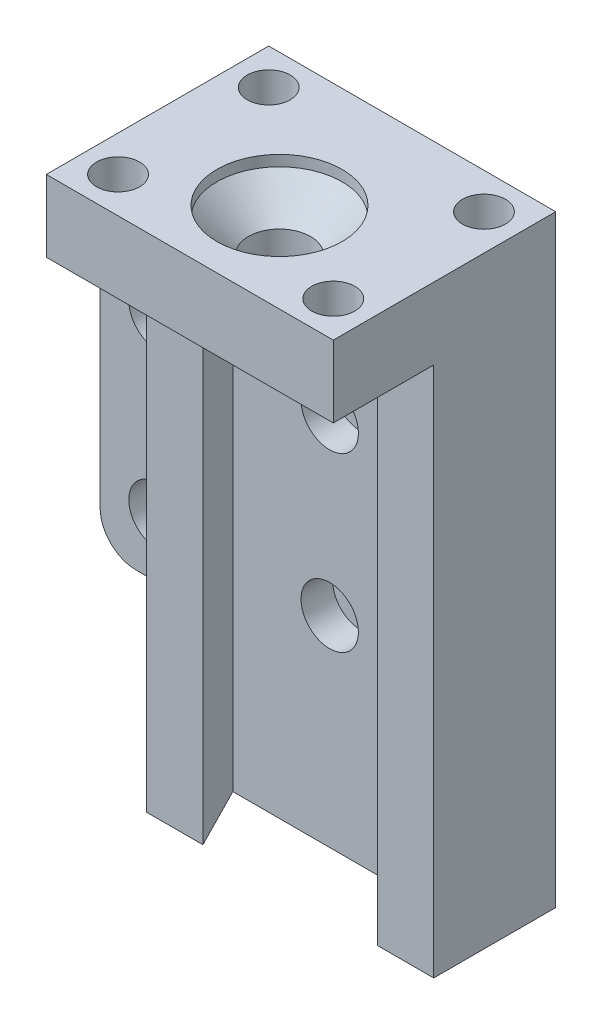
ISO-10303-21;
HEADER;
FILE_DESCRIPTION(('STEP AP214'),'2;1');
FILE_NAME('part.step','',(''),(''),'','','');
FILE_SCHEMA(('AUTOMOTIVE_DESIGN { 1 0 10303 214 1 1 1 1 }'));
ENDSEC;
DATA;
#1=APPLICATION_CONTEXT('core data for automotive mechanical design processes');
#2=APPLICATION_PROTOCOL_DEFINITION('international standard','automotive_design',2000,#1);
#3=PRODUCT_CONTEXT('',#1,'mechanical');
#4=PRODUCT('Part','Part','',(#3));
#5=PRODUCT_RELATED_PRODUCT_CATEGORY('part','',(#4));
#6=PRODUCT_DEFINITION_FORMATION('','',#4);
#7=PRODUCT_DEFINITION_CONTEXT('part definition',#1,'design');
#8=PRODUCT_DEFINITION('design','',#6,#7);
#9=PRODUCT_DEFINITION_SHAPE('','',#8);
#10=(LENGTH_UNIT() NAMED_UNIT(*) SI_UNIT(.MILLI.,.METRE.));
#11=(NAMED_UNIT(*) PLANE_ANGLE_UNIT() SI_UNIT($,.RADIAN.));
#12=(NAMED_UNIT(*) SI_UNIT($,.STERADIAN.) SOLID_ANGLE_UNIT());
#13=UNCERTAINTY_MEASURE_WITH_UNIT(LENGTH_MEASURE(1.E-05),#10,'distance_accuracy_value','');
#14=(GEOMETRIC_REPRESENTATION_CONTEXT(3) GLOBAL_UNCERTAINTY_ASSIGNED_CONTEXT((#13)) GLOBAL_UNIT_ASSIGNED_CONTEXT((#10,
#11,#12)) REPRESENTATION_CONTEXT('',''));
#15=CARTESIAN_POINT('',(0.,0.,0.));
#16=DIRECTION('',(0.,0.,1.));
#17=DIRECTION('',(1.,0.,0.));
#18=AXIS2_PLACEMENT_3D('',#15,#16,#17);
#19=CARTESIAN_POINT('',(0.,-20.,10.));
#20=DIRECTION('',(0.,-1.,0.));
#21=DIRECTION('',(1.,0.,0.));
#22=AXIS2_PLACEMENT_3D('',#19,#20,#21);
#23=PLANE('',#22);
#24=DIRECTION('',(1.,0.,0.));
#25=VECTOR('',#24,1.);
#26=CARTESIAN_POINT('',(-15.,-20.,8.50000000000001));
#27=LINE('',#26,#25);
#28=CARTESIAN_POINT('',(-15.,-20.,8.50000000000001));
#29=VERTEX_POINT('',#28);
#30=CARTESIAN_POINT('',(-9.99999999999999,-20.,8.50000000000001));
#31=VERTEX_POINT('',#30);
#32=EDGE_CURVE('E373',#29,#31,#27,.T.);
#33=ORIENTED_EDGE('',*,*,#32,.F.);
#34=DIRECTION('',(0.,0.,-1.));
#35=VECTOR('',#34,1.);
#36=CARTESIAN_POINT('',(-15.,-20.,10.));
#37=LINE('',#36,#35);
#38=CARTESIAN_POINT('',(-15.,-20.,0.));
#39=VERTEX_POINT('',#38);
#40=EDGE_CURVE('E203',#29,#39,#37,.T.);
#41=ORIENTED_EDGE('',*,*,#40,.T.);
#42=DIRECTION('',(-1.,0.,0.));
#43=VECTOR('',#42,1.);
#44=CARTESIAN_POINT('',(0.,-20.,0.));
#45=LINE('',#44,#43);
#46=CARTESIAN_POINT('',(-9.99999999999999,-20.,0.));
#47=VERTEX_POINT('',#46);
#48=EDGE_CURVE('E193',#47,#39,#45,.T.);
#49=ORIENTED_EDGE('',*,*,#48,.F.);
#50=DIRECTION('',(0.,0.,1.));
#51=VECTOR('',#50,1.);
#52=CARTESIAN_POINT('',(-9.99999999999999,-20.,10.));
#53=LINE('',#52,#51);
#54=EDGE_CURVE('E201',#47,#31,#53,.T.);
#55=ORIENTED_EDGE('',*,*,#54,.T.);
#56=EDGE_LOOP('',(#33,#41,#49,#55));
#57=FACE_BOUND('',#56,.T.);
#58=ADVANCED_FACE('F34',(#57),#23,.T.);
#59=CARTESIAN_POINT('',(0.,20.,10.));
#60=DIRECTION('',(0.,-1.,0.));
#61=DIRECTION('',(1.,0.,0.));
#62=AXIS2_PLACEMENT_3D('',#59,#60,#61);
#63=PLANE('',#62);
#64=DIRECTION('',(0.,0.,-1.));
#65=VECTOR('',#64,1.);
#66=CARTESIAN_POINT('',(-15.,20.,10.));
#67=LINE('',#66,#65);
#68=CARTESIAN_POINT('',(-15.,20.,0.));
#69=VERTEX_POINT('',#68);
#70=CARTESIAN_POINT('',(-15.,20.,8.50000000000001));
#71=VERTEX_POINT('',#70);
#72=EDGE_CURVE('E179',#69,#71,#67,.F.);
#73=ORIENTED_EDGE('',*,*,#72,.T.);
#74=DIRECTION('',(-1.,0.,0.));
#75=VECTOR('',#74,1.);
#76=CARTESIAN_POINT('',(-9.99999999999999,20.,8.50000000000001));
#77=LINE('',#76,#75);
#78=CARTESIAN_POINT('',(-9.99999999999999,20.,8.50000000000001));
#79=VERTEX_POINT('',#78);
#80=EDGE_CURVE('E49',#79,#71,#77,.T.);
#81=ORIENTED_EDGE('',*,*,#80,.F.);
#82=DIRECTION('',(0.,0.,1.));
#83=VECTOR('',#82,1.);
#84=CARTESIAN_POINT('',(-9.99999999999999,20.,0.));
#85=LINE('',#84,#83);
#86=CARTESIAN_POINT('',(-9.99999999999999,20.,0.));
#87=VERTEX_POINT('',#86);
#88=EDGE_CURVE('E171',#79,#87,#85,.F.);
#89=ORIENTED_EDGE('',*,*,#88,.T.);
#90=DIRECTION('',(-1.,0.,0.));
#91=VECTOR('',#90,1.);
#92=CARTESIAN_POINT('',(0.,20.,0.));
#93=LINE('',#92,#91);
#94=EDGE_CURVE('E214',#87,#69,#93,.T.);
#95=ORIENTED_EDGE('',*,*,#94,.T.);
#96=EDGE_LOOP('',(#73,#81,#89,#95));
#97=FACE_BOUND('',#96,.T.);
#98=ADVANCED_FACE('F245',(#97),#63,.F.);
#99=CARTESIAN_POINT('',(35.,40.,17.));
#100=DIRECTION('',(0.,0.,-1.));
#101=DIRECTION('',(-1.,0.,0.));
#102=AXIS2_PLACEMENT_3D('',#99,#100,#101);
#103=PLANE('',#102);
#104=DIRECTION('',(1.,0.,0.));
#105=VECTOR('',#104,1.);
#106=CARTESIAN_POINT('',(-4.99999999999999,34.,17.));
#107=LINE('',#106,#105);
#108=CARTESIAN_POINT('',(-4.99999999999999,34.,17.));
#109=VERTEX_POINT('',#108);
#110=CARTESIAN_POINT('',(2.83096632070263,34.,17.));
#111=VERTEX_POINT('',#110);
#112=EDGE_CURVE('E216',#109,#111,#107,.T.);
#113=ORIENTED_EDGE('',*,*,#112,.F.);
#114=DIRECTION('',(0.,-1.,0.));
#115=VECTOR('',#114,1.);
#116=CARTESIAN_POINT('',(-4.99999999999999,40.,17.));
#117=LINE('',#116,#115);
#118=CARTESIAN_POINT('',(-4.99999999999998,-40.,17.));
#119=VERTEX_POINT('',#118);
#120=EDGE_CURVE('E235',#109,#119,#117,.T.);
#121=ORIENTED_EDGE('',*,*,#120,.T.);
#122=DIRECTION('',(1.,0.,0.));
#123=VECTOR('',#122,1.);
#124=CARTESIAN_POINT('',(35.,-40.,17.));
#125=LINE('',#124,#123);
#126=CARTESIAN_POINT('',(2.83096632070264,-40.,17.));
#127=VERTEX_POINT('',#126);
#128=EDGE_CURVE('E312',#119,#127,#125,.T.);
#129=ORIENTED_EDGE('',*,*,#128,.T.);
#130=DIRECTION('',(0.,1.,0.));
#131=VECTOR('',#130,1.);
#132=CARTESIAN_POINT('',(2.83096632070264,-74.0771184227775,17.));
#133=LINE('',#132,#131);
#134=EDGE_CURVE('E291',#127,#111,#133,.T.);
#135=ORIENTED_EDGE('',*,*,#134,.T.);
#136=EDGE_LOOP('',(#113,#121,#129,#135));
#137=FACE_BOUND('',#136,.T.);
#138=ADVANCED_FACE('F454',(#137),#103,.F.);
#139=CARTESIAN_POINT('',(27.1690336792974,34.,17.));
#140=VERTEX_POINT('',#139);
#141=CARTESIAN_POINT('',(35.,34.,17.));
#142=VERTEX_POINT('',#141);
#143=EDGE_CURVE('E209',#140,#142,#107,.T.);
#144=ORIENTED_EDGE('',*,*,#143,.F.);
#145=DIRECTION('',(0.,1.,0.));
#146=VECTOR('',#145,1.);
#147=CARTESIAN_POINT('',(27.1690336792974,-74.0771184227775,17.));
#148=LINE('',#147,#146);
#149=CARTESIAN_POINT('',(27.1690336792974,-40.,17.));
#150=VERTEX_POINT('',#149);
#151=EDGE_CURVE('E283',#150,#140,#148,.T.);
#152=ORIENTED_EDGE('',*,*,#151,.F.);
#153=CARTESIAN_POINT('',(35.,-40.,17.));
#154=VERTEX_POINT('',#153);
#155=EDGE_CURVE('E311',#150,#154,#125,.T.);
#156=ORIENTED_EDGE('',*,*,#155,.T.);
#157=DIRECTION('',(0.,-1.,0.));
#158=VECTOR('',#157,1.);
#159=CARTESIAN_POINT('',(35.,40.,17.));
#160=LINE('',#159,#158);
#161=EDGE_CURVE('E237',#142,#154,#160,.T.);
#162=ORIENTED_EDGE('',*,*,#161,.F.);
#163=EDGE_LOOP('',(#144,#152,#156,#162));
#164=FACE_BOUND('',#163,.T.);
#165=ADVANCED_FACE('F322',(#164),#103,.F.);
#166=CARTESIAN_POINT('',(-20.,0.,10.));
#167=DIRECTION('',(-1.,0.,0.));
#168=DIRECTION('',(0.,0.,1.));
#169=AXIS2_PLACEMENT_3D('',#166,#167,#168);
#170=PLANE('',#169);
#171=DIRECTION('',(0.,-1.,0.));
#172=VECTOR('',#171,1.);
#173=CARTESIAN_POINT('',(-20.,15.,8.50000000000001));
#174=LINE('',#173,#172);
#175=CARTESIAN_POINT('',(-20.,15.,8.50000000000001));
#176=VERTEX_POINT('',#175);
#177=CARTESIAN_POINT('',(-20.,-15.,8.50000000000001));
#178=VERTEX_POINT('',#177);
#179=EDGE_CURVE('E230',#176,#178,#174,.T.);
#180=ORIENTED_EDGE('',*,*,#179,.F.);
#181=DIRECTION('',(0.,0.,-1.));
#182=VECTOR('',#181,1.);
#183=CARTESIAN_POINT('',(-20.,15.,0.));
#184=LINE('',#183,#182);
#185=CARTESIAN_POINT('',(-20.,15.,0.));
#186=VERTEX_POINT('',#185);
#187=EDGE_CURVE('E182',#176,#186,#184,.T.);
#188=ORIENTED_EDGE('',*,*,#187,.T.);
#189=DIRECTION('',(0.,1.,0.));
#190=VECTOR('',#189,1.);
#191=CARTESIAN_POINT('',(-20.,0.,0.));
#192=LINE('',#191,#190);
#193=CARTESIAN_POINT('',(-20.,-15.,0.));
#194=VERTEX_POINT('',#193);
#195=EDGE_CURVE('E206',#194,#186,#192,.T.);
#196=ORIENTED_EDGE('',*,*,#195,.F.);
#197=DIRECTION('',(0.,0.,-1.));
#198=VECTOR('',#197,1.);
#199=CARTESIAN_POINT('',(-20.,-15.,10.));
#200=LINE('',#199,#198);
#201=EDGE_CURVE('E177',#194,#178,#200,.F.);
#202=ORIENTED_EDGE('',*,*,#201,.T.);
#203=EDGE_LOOP('',(#180,#188,#196,#202));
#204=FACE_BOUND('',#203,.T.);
#205=ADVANCED_FACE('F227',(#204),#170,.T.);
#206=CARTESIAN_POINT('',(35.,0.,10.));
#207=DIRECTION('',(-1.,0.,0.));
#208=DIRECTION('',(0.,0.,1.));
#209=AXIS2_PLACEMENT_3D('',#206,#207,#208);
#210=PLANE('',#209);
#211=DIRECTION('',(0.,0.,-1.));
#212=VECTOR('',#211,1.);
#213=CARTESIAN_POINT('',(35.,-40.,3.));
#214=LINE('',#213,#212);
#215=CARTESIAN_POINT('',(35.,-40.,0.));
#216=VERTEX_POINT('',#215);
#217=EDGE_CURVE('E306',#154,#216,#214,.T.);
#218=ORIENTED_EDGE('',*,*,#217,.T.);
#219=DIRECTION('',(0.,1.,0.));
#220=VECTOR('',#219,1.);
#221=CARTESIAN_POINT('',(35.,0.,0.));
#222=LINE('',#221,#220);
#223=CARTESIAN_POINT('',(35.,44.,0.));
#224=VERTEX_POINT('',#223);
#225=EDGE_CURVE('E205',#216,#224,#222,.T.);
#226=ORIENTED_EDGE('',*,*,#225,.T.);
#227=DIRECTION('',(0.,0.,-1.));
#228=VECTOR('',#227,1.);
#229=CARTESIAN_POINT('',(35.,44.,3.));
#230=LINE('',#229,#228);
#231=CARTESIAN_POINT('',(35.,44.,31.));
#232=VERTEX_POINT('',#231);
#233=EDGE_CURVE('E255',#232,#224,#230,.T.);
#234=ORIENTED_EDGE('',*,*,#233,.F.);
#235=DIRECTION('',(0.,1.,0.));
#236=VECTOR('',#235,1.);
#237=CARTESIAN_POINT('',(35.,40.,31.));
#238=LINE('',#237,#236);
#239=CARTESIAN_POINT('',(35.,34.,31.));
#240=VERTEX_POINT('',#239);
#241=EDGE_CURVE('E270',#240,#232,#238,.T.);
#242=ORIENTED_EDGE('',*,*,#241,.F.);
#243=DIRECTION('',(0.,0.,-1.));
#244=VECTOR('',#243,1.);
#245=CARTESIAN_POINT('',(35.,34.,31.));
#246=LINE('',#245,#244);
#247=EDGE_CURVE('E271',#240,#142,#246,.T.);
#248=ORIENTED_EDGE('',*,*,#247,.T.);
#249=ORIENTED_EDGE('',*,*,#161,.T.);
#250=EDGE_LOOP('',(#218,#226,#234,#242,#248,#249));
#251=FACE_BOUND('',#250,.T.);
#252=ADVANCED_FACE('F315',(#251),#210,.F.);
#253=CARTESIAN_POINT('',(0.,0.,0.));
#254=DIRECTION('',(0.,0.,1.));
#255=DIRECTION('',(1.,0.,0.));
#256=AXIS2_PLACEMENT_3D('',#253,#254,#255);
#257=PLANE('',#256);
#258=CARTESIAN_POINT('',(-12.,12.,0.));
#259=DIRECTION('',(0.,0.,1.));
#260=DIRECTION('',(1.,0.,0.));
#261=AXIS2_PLACEMENT_3D('',#258,#259,#260);
#262=CIRCLE('',#261,2.25);
#263=CARTESIAN_POINT('',(-9.75,12.,0.));
#264=VERTEX_POINT('',#263);
#265=EDGE_CURVE('E411',#264,#264,#262,.T.);
#266=ORIENTED_EDGE('',*,*,#265,.T.);
#267=EDGE_LOOP('',(#266));
#268=FACE_BOUND('',#267,.T.);
#269=CARTESIAN_POINT('',(12.,12.,0.));
#270=DIRECTION('',(0.,0.,1.));
#271=DIRECTION('',(1.,0.,0.));
#272=AXIS2_PLACEMENT_3D('',#269,#270,#271);
#273=CIRCLE('',#272,2.25);
#274=CARTESIAN_POINT('',(14.25,12.,0.));
#275=VERTEX_POINT('',#274);
#276=EDGE_CURVE('E399',#275,#275,#273,.T.);
#277=ORIENTED_EDGE('',*,*,#276,.T.);
#278=EDGE_LOOP('',(#277));
#279=FACE_BOUND('',#278,.T.);
#280=CARTESIAN_POINT('',(12.,-12.,0.));
#281=DIRECTION('',(0.,0.,1.));
#282=DIRECTION('',(1.,0.,0.));
#283=AXIS2_PLACEMENT_3D('',#280,#281,#282);
#284=CIRCLE('',#283,2.25);
#285=CARTESIAN_POINT('',(14.25,-12.,0.));
#286=VERTEX_POINT('',#285);
#287=EDGE_CURVE('E387',#286,#286,#284,.T.);
#288=ORIENTED_EDGE('',*,*,#287,.T.);
#289=EDGE_LOOP('',(#288));
#290=FACE_BOUND('',#289,.T.);
#291=CARTESIAN_POINT('',(-12.,-12.,0.));
#292=DIRECTION('',(0.,0.,1.));
#293=DIRECTION('',(1.,0.,0.));
#294=AXIS2_PLACEMENT_3D('',#291,#292,#293);
#295=CIRCLE('',#294,2.25);
#296=CARTESIAN_POINT('',(-9.75,-12.,0.));
#297=VERTEX_POINT('',#296);
#298=EDGE_CURVE('E163',#297,#297,#295,.T.);
#299=ORIENTED_EDGE('',*,*,#298,.T.);
#300=EDGE_LOOP('',(#299));
#301=FACE_BOUND('',#300,.T.);
#302=ORIENTED_EDGE('',*,*,#48,.T.);
#303=CARTESIAN_POINT('',(-15.,-15.,0.));
#304=DIRECTION('',(0.,0.,1.));
#305=DIRECTION('',(1.,0.,0.));
#306=AXIS2_PLACEMENT_3D('',#303,#304,#305);
#307=CIRCLE('',#306,5.);
#308=EDGE_CURVE('E221',#39,#194,#307,.F.);
#309=ORIENTED_EDGE('',*,*,#308,.T.);
#310=ORIENTED_EDGE('',*,*,#195,.T.);
#311=CARTESIAN_POINT('',(-15.,15.,0.));
#312=DIRECTION('',(0.,0.,1.));
#313=DIRECTION('',(1.,0.,0.));
#314=AXIS2_PLACEMENT_3D('',#311,#312,#313);
#315=CIRCLE('',#314,5.);
#316=EDGE_CURVE('E211',#186,#69,#315,.F.);
#317=ORIENTED_EDGE('',*,*,#316,.T.);
#318=ORIENTED_EDGE('',*,*,#94,.F.);
#319=CARTESIAN_POINT('',(-9.99999999999999,25.,0.));
#320=DIRECTION('',(0.,0.,1.));
#321=DIRECTION('',(1.,0.,0.));
#322=AXIS2_PLACEMENT_3D('',#319,#320,#321);
#323=CIRCLE('',#322,5.);
#324=CARTESIAN_POINT('',(-4.99999999999999,25.,0.));
#325=VERTEX_POINT('',#324);
#326=EDGE_CURVE('E11',#87,#325,#323,.T.);
#327=ORIENTED_EDGE('',*,*,#326,.T.);
#328=DIRECTION('',(0.,-1.,0.));
#329=VECTOR('',#328,1.);
#330=CARTESIAN_POINT('',(-4.99999999999999,44.,0.));
#331=LINE('',#330,#329);
#332=CARTESIAN_POINT('',(-4.99999999999999,44.,0.));
#333=VERTEX_POINT('',#332);
#334=EDGE_CURVE('E176',#333,#325,#331,.T.);
#335=ORIENTED_EDGE('',*,*,#334,.F.);
#336=DIRECTION('',(-1.,0.,0.));
#337=VECTOR('',#336,1.);
#338=CARTESIAN_POINT('',(35.,44.,0.));
#339=LINE('',#338,#337);
#340=EDGE_CURVE('E248',#224,#333,#339,.T.);
#341=ORIENTED_EDGE('',*,*,#340,.F.);
#342=ORIENTED_EDGE('',*,*,#225,.F.);
#343=DIRECTION('',(1.,0.,0.));
#344=VECTOR('',#343,1.);
#345=CARTESIAN_POINT('',(35.,-40.,0.));
#346=LINE('',#345,#344);
#347=CARTESIAN_POINT('',(-4.99999999999999,-40.,0.));
#348=VERTEX_POINT('',#347);
#349=EDGE_CURVE('E256',#348,#216,#346,.T.);
#350=ORIENTED_EDGE('',*,*,#349,.F.);
#351=DIRECTION('',(0.,-1.,0.));
#352=VECTOR('',#351,1.);
#353=CARTESIAN_POINT('',(-4.99999999999999,-20.,0.));
#354=LINE('',#353,#352);
#355=CARTESIAN_POINT('',(-4.99999999999999,-25.,0.));
#356=VERTEX_POINT('',#355);
#357=EDGE_CURVE('E195',#356,#348,#354,.T.);
#358=ORIENTED_EDGE('',*,*,#357,.F.);
#359=CARTESIAN_POINT('',(-9.99999999999999,-25.,0.));
#360=DIRECTION('',(0.,0.,1.));
#361=DIRECTION('',(1.,0.,0.));
#362=AXIS2_PLACEMENT_3D('',#359,#360,#361);
#363=CIRCLE('',#362,5.);
#364=EDGE_CURVE('E42',#356,#47,#363,.T.);
#365=ORIENTED_EDGE('',*,*,#364,.T.);
#366=EDGE_LOOP('',(#302,#309,#310,#317,#318,#327,#335,#341,#342,#350,#358,#365));
#367=FACE_BOUND('',#366,.T.);
#368=ADVANCED_FACE('F192',(#268,#279,#290,#301,#367),#257,.F.);
#369=CARTESIAN_POINT('',(-4.99999999999999,40.,3.));
#370=DIRECTION('',(1.,0.,0.));
#371=DIRECTION('',(0.,0.,-1.));
#372=AXIS2_PLACEMENT_3D('',#369,#370,#371);
#373=PLANE('',#372);
#374=DIRECTION('',(0.,1.,0.));
#375=VECTOR('',#374,1.);
#376=CARTESIAN_POINT('',(-4.99999999999999,-25.,8.50000000000001));
#377=LINE('',#376,#375);
#378=CARTESIAN_POINT('',(-4.99999999999999,-25.,8.50000000000001));
#379=VERTEX_POINT('',#378);
#380=CARTESIAN_POINT('',(-4.99999999999999,25.,8.49999999999999));
#381=VERTEX_POINT('',#380);
#382=EDGE_CURVE('E156',#379,#381,#377,.T.);
#383=ORIENTED_EDGE('',*,*,#382,.F.);
#384=DIRECTION('',(0.,0.,1.));
#385=VECTOR('',#384,1.);
#386=CARTESIAN_POINT('',(-4.99999999999999,-25.,3.));
#387=LINE('',#386,#385);
#388=EDGE_CURVE('E57',#379,#356,#387,.F.);
#389=ORIENTED_EDGE('',*,*,#388,.T.);
#390=ORIENTED_EDGE('',*,*,#357,.T.);
#391=DIRECTION('',(0.,0.,1.));
#392=VECTOR('',#391,1.);
#393=CARTESIAN_POINT('',(-4.99999999999999,-40.,3.));
#394=LINE('',#393,#392);
#395=EDGE_CURVE('E308',#348,#119,#394,.T.);
#396=ORIENTED_EDGE('',*,*,#395,.T.);
#397=ORIENTED_EDGE('',*,*,#120,.F.);
#398=DIRECTION('',(0.,0.,-1.));
#399=VECTOR('',#398,1.);
#400=CARTESIAN_POINT('',(-4.99999999999999,34.,31.));
#401=LINE('',#400,#399);
#402=CARTESIAN_POINT('',(-4.99999999999999,34.,31.));
#403=VERTEX_POINT('',#402);
#404=EDGE_CURVE('E276',#403,#109,#401,.T.);
#405=ORIENTED_EDGE('',*,*,#404,.F.);
#406=DIRECTION('',(0.,-1.,0.));
#407=VECTOR('',#406,1.);
#408=CARTESIAN_POINT('',(-4.99999999999999,40.,31.));
#409=LINE('',#408,#407);
#410=CARTESIAN_POINT('',(-4.99999999999999,44.,31.));
#411=VERTEX_POINT('',#410);
#412=EDGE_CURVE('E265',#411,#403,#409,.T.);
#413=ORIENTED_EDGE('',*,*,#412,.F.);
#414=DIRECTION('',(0.,0.,1.));
#415=VECTOR('',#414,1.);
#416=CARTESIAN_POINT('',(-4.99999999999999,44.,3.));
#417=LINE('',#416,#415);
#418=EDGE_CURVE('E249',#333,#411,#417,.T.);
#419=ORIENTED_EDGE('',*,*,#418,.F.);
#420=ORIENTED_EDGE('',*,*,#334,.T.);
#421=DIRECTION('',(0.,0.,1.));
#422=VECTOR('',#421,1.);
#423=CARTESIAN_POINT('',(-4.99999999999999,25.,10.));
#424=LINE('',#423,#422);
#425=EDGE_CURVE('E170',#325,#381,#424,.T.);
#426=ORIENTED_EDGE('',*,*,#425,.T.);
#427=EDGE_LOOP('',(#383,#389,#390,#396,#397,#405,#413,#419,#420,#426));
#428=FACE_BOUND('',#427,.T.);
#429=ADVANCED_FACE('F174',(#428),#373,.F.);
#430=CARTESIAN_POINT('',(0.,-40.,0.));
#431=DIRECTION('',(0.,-1.,0.));
#432=DIRECTION('',(1.,0.,0.));
#433=AXIS2_PLACEMENT_3D('',#430,#431,#432);
#434=PLANE('',#433);
#435=DIRECTION('',(0.453990499739545,0.,-0.891006524188369));
#436=VECTOR('',#435,1.);
#437=CARTESIAN_POINT('',(31.5,-40.,8.5));
#438=LINE('',#437,#436);
#439=CARTESIAN_POINT('',(31.5,-40.,8.5));
#440=VERTEX_POINT('',#439);
#441=EDGE_CURVE('E297',#150,#440,#438,.T.);
#442=ORIENTED_EDGE('',*,*,#441,.T.);
#443=DIRECTION('',(-1.,0.,0.));
#444=VECTOR('',#443,1.);
#445=CARTESIAN_POINT('',(-1.49999999999998,-40.,8.5));
#446=LINE('',#445,#444);
#447=CARTESIAN_POINT('',(-1.49999999999999,-40.,8.5));
#448=VERTEX_POINT('',#447);
#449=EDGE_CURVE('E293',#440,#448,#446,.T.);
#450=ORIENTED_EDGE('',*,*,#449,.T.);
#451=DIRECTION('',(0.453990499739545,0.,0.891006524188369));
#452=VECTOR('',#451,1.);
#453=CARTESIAN_POINT('',(-1.49999999999998,-40.,8.5));
#454=LINE('',#453,#452);
#455=EDGE_CURVE('E288',#448,#127,#454,.T.);
#456=ORIENTED_EDGE('',*,*,#455,.T.);
#457=ORIENTED_EDGE('',*,*,#128,.F.);
#458=ORIENTED_EDGE('',*,*,#395,.F.);
#459=ORIENTED_EDGE('',*,*,#349,.T.);
#460=ORIENTED_EDGE('',*,*,#217,.F.);
#461=ORIENTED_EDGE('',*,*,#155,.F.);
#462=EDGE_LOOP('',(#442,#450,#456,#457,#458,#459,#460,#461));
#463=FACE_BOUND('',#462,.T.);
#464=ADVANCED_FACE('F324',(#463),#434,.T.);
#465=CARTESIAN_POINT('',(0.,34.,0.));
#466=DIRECTION('',(0.,1.,0.));
#467=DIRECTION('',(0.,0.,1.));
#468=AXIS2_PLACEMENT_3D('',#465,#466,#467);
#469=PLANE('',#468);
#470=CARTESIAN_POINT('',(15.,34.,18.5));
#471=DIRECTION('',(0.,1.,0.));
#472=DIRECTION('',(0.,0.,1.));
#473=AXIS2_PLACEMENT_3D('',#470,#471,#472);
#474=CIRCLE('',#473,4.325);
#475=CARTESIAN_POINT('',(15.,34.,22.825));
#476=VERTEX_POINT('',#475);
#477=EDGE_CURVE('E361',#476,#476,#474,.F.);
#478=ORIENTED_EDGE('',*,*,#477,.F.);
#479=EDGE_LOOP('',(#478));
#480=FACE_BOUND('',#479,.T.);
#481=CARTESIAN_POINT('',(2.12779385389692E-13,34.,26.));
#482=DIRECTION('',(0.,1.,0.));
#483=DIRECTION('',(-1.,0.,0.));
#484=AXIS2_PLACEMENT_3D('',#481,#482,#483);
#485=CIRCLE('',#484,3.);
#486=CARTESIAN_POINT('',(-2.99999999999979,34.,26.));
#487=VERTEX_POINT('',#486);
#488=EDGE_CURVE('E341',#487,#487,#485,.T.);
#489=ORIENTED_EDGE('',*,*,#488,.T.);
#490=EDGE_LOOP('',(#489));
#491=FACE_BOUND('',#490,.T.);
#492=CARTESIAN_POINT('',(30.0000000000002,34.,26.));
#493=DIRECTION('',(0.,1.,0.));
#494=DIRECTION('',(-1.,0.,0.));
#495=AXIS2_PLACEMENT_3D('',#492,#493,#494);
#496=CIRCLE('',#495,3.);
#497=CARTESIAN_POINT('',(27.0000000000002,34.,26.));
#498=VERTEX_POINT('',#497);
#499=EDGE_CURVE('E348',#498,#498,#496,.T.);
#500=ORIENTED_EDGE('',*,*,#499,.T.);
#501=EDGE_LOOP('',(#500));
#502=FACE_BOUND('',#501,.T.);
#503=DIRECTION('',(0.453990499739545,0.,0.891006524188369));
#504=VECTOR('',#503,1.);
#505=CARTESIAN_POINT('',(-1.49999999999999,34.,8.5));
#506=LINE('',#505,#504);
#507=CARTESIAN_POINT('',(-1.49999999999999,34.,8.5));
#508=VERTEX_POINT('',#507);
#509=EDGE_CURVE('E279',#508,#111,#506,.T.);
#510=ORIENTED_EDGE('',*,*,#509,.F.);
#511=DIRECTION('',(-1.,0.,0.));
#512=VECTOR('',#511,1.);
#513=CARTESIAN_POINT('',(-1.49999999999999,34.,8.5));
#514=LINE('',#513,#512);
#515=CARTESIAN_POINT('',(31.5,34.,8.5));
#516=VERTEX_POINT('',#515);
#517=EDGE_CURVE('E280',#516,#508,#514,.T.);
#518=ORIENTED_EDGE('',*,*,#517,.F.);
#519=DIRECTION('',(0.453990499739545,0.,-0.891006524188369));
#520=VECTOR('',#519,1.);
#521=CARTESIAN_POINT('',(31.5,34.,8.5));
#522=LINE('',#521,#520);
#523=EDGE_CURVE('E284',#140,#516,#522,.T.);
#524=ORIENTED_EDGE('',*,*,#523,.F.);
#525=ORIENTED_EDGE('',*,*,#143,.T.);
#526=ORIENTED_EDGE('',*,*,#247,.F.);
#527=DIRECTION('',(1.,0.,0.));
#528=VECTOR('',#527,1.);
#529=CARTESIAN_POINT('',(-4.99999999999999,34.,31.));
#530=LINE('',#529,#528);
#531=EDGE_CURVE('E268',#403,#240,#530,.T.);
#532=ORIENTED_EDGE('',*,*,#531,.F.);
#533=ORIENTED_EDGE('',*,*,#404,.T.);
#534=ORIENTED_EDGE('',*,*,#112,.T.);
#535=EDGE_LOOP('',(#510,#518,#524,#525,#526,#532,#533,#534));
#536=FACE_BOUND('',#535,.T.);
#537=ADVANCED_FACE('F494',(#480,#491,#502,#536),#469,.F.);
#538=CARTESIAN_POINT('',(31.5,-74.0771184227775,8.5));
#539=DIRECTION('',(0.891006524188369,0.,0.453990499739545));
#540=DIRECTION('',(0.453990499739545,0.,-0.891006524188369));
#541=AXIS2_PLACEMENT_3D('',#538,#539,#540);
#542=PLANE('',#541);
#543=ORIENTED_EDGE('',*,*,#151,.T.);
#544=ORIENTED_EDGE('',*,*,#523,.T.);
#545=DIRECTION('',(0.,1.,0.));
#546=VECTOR('',#545,1.);
#547=CARTESIAN_POINT('',(31.5,-74.0771184227775,8.5));
#548=LINE('',#547,#546);
#549=EDGE_CURVE('E296',#440,#516,#548,.T.);
#550=ORIENTED_EDGE('',*,*,#549,.F.);
#551=ORIENTED_EDGE('',*,*,#441,.F.);
#552=EDGE_LOOP('',(#543,#544,#550,#551));
#553=FACE_BOUND('',#552,.T.);
#554=ADVANCED_FACE('F497',(#553),#542,.F.);
#555=CARTESIAN_POINT('',(-1.49999999999998,-74.0771184227775,8.5));
#556=DIRECTION('',(0.,0.,-1.));
#557=DIRECTION('',(-1.,0.,0.));
#558=AXIS2_PLACEMENT_3D('',#555,#556,#557);
#559=PLANE('',#558);
#560=CARTESIAN_POINT('',(12.,12.,8.5));
#561=DIRECTION('',(0.,0.,1.));
#562=DIRECTION('',(1.,0.,0.));
#563=AXIS2_PLACEMENT_3D('',#560,#561,#562);
#564=CIRCLE('',#563,4.);
#565=CARTESIAN_POINT('',(16.,12.,8.5));
#566=VERTEX_POINT('',#565);
#567=EDGE_CURVE('E408',#566,#566,#564,.T.);
#568=ORIENTED_EDGE('',*,*,#567,.F.);
#569=EDGE_LOOP('',(#568));
#570=FACE_BOUND('',#569,.T.);
#571=CARTESIAN_POINT('',(12.,-12.,8.5));
#572=DIRECTION('',(0.,0.,1.));
#573=DIRECTION('',(1.,0.,0.));
#574=AXIS2_PLACEMENT_3D('',#571,#572,#573);
#575=CIRCLE('',#574,4.);
#576=CARTESIAN_POINT('',(16.,-12.,8.5));
#577=VERTEX_POINT('',#576);
#578=EDGE_CURVE('E396',#577,#577,#575,.T.);
#579=ORIENTED_EDGE('',*,*,#578,.F.);
#580=EDGE_LOOP('',(#579));
#581=FACE_BOUND('',#580,.T.);
#582=ORIENTED_EDGE('',*,*,#549,.T.);
#583=ORIENTED_EDGE('',*,*,#517,.T.);
#584=DIRECTION('',(0.,1.,0.));
#585=VECTOR('',#584,1.);
#586=CARTESIAN_POINT('',(-1.49999999999998,-74.0771184227775,8.5));
#587=LINE('',#586,#585);
#588=EDGE_CURVE('E292',#448,#508,#587,.T.);
#589=ORIENTED_EDGE('',*,*,#588,.F.);
#590=ORIENTED_EDGE('',*,*,#449,.F.);
#591=EDGE_LOOP('',(#582,#583,#589,#590));
#592=FACE_BOUND('',#591,.T.);
#593=ADVANCED_FACE('F501',(#570,#581,#592),#559,.F.);
#594=CARTESIAN_POINT('',(-1.49999999999998,-74.0771184227775,8.5));
#595=DIRECTION('',(-0.891006524188369,0.,0.453990499739544));
#596=DIRECTION('',(0.453990499739545,0.,0.891006524188369));
#597=AXIS2_PLACEMENT_3D('',#594,#595,#596);
#598=PLANE('',#597);
#599=ORIENTED_EDGE('',*,*,#588,.T.);
#600=ORIENTED_EDGE('',*,*,#509,.T.);
#601=ORIENTED_EDGE('',*,*,#134,.F.);
#602=ORIENTED_EDGE('',*,*,#455,.F.);
#603=EDGE_LOOP('',(#599,#600,#601,#602));
#604=FACE_BOUND('',#603,.T.);
#605=ADVANCED_FACE('F492',(#604),#598,.F.);
#606=CARTESIAN_POINT('',(0.,0.,31.));
#607=DIRECTION('',(0.,0.,1.));
#608=DIRECTION('',(1.,0.,0.));
#609=AXIS2_PLACEMENT_3D('',#606,#607,#608);
#610=PLANE('',#609);
#611=ORIENTED_EDGE('',*,*,#412,.T.);
#612=ORIENTED_EDGE('',*,*,#531,.T.);
#613=ORIENTED_EDGE('',*,*,#241,.T.);
#614=DIRECTION('',(1.,0.,0.));
#615=VECTOR('',#614,1.);
#616=CARTESIAN_POINT('',(-4.99999999999999,44.,31.));
#617=LINE('',#616,#615);
#618=EDGE_CURVE('E262',#411,#232,#617,.T.);
#619=ORIENTED_EDGE('',*,*,#618,.F.);
#620=EDGE_LOOP('',(#611,#612,#613,#619));
#621=FACE_BOUND('',#620,.T.);
#622=ADVANCED_FACE('F488',(#621),#610,.T.);
#623=CARTESIAN_POINT('',(0.,44.,0.));
#624=DIRECTION('',(0.,1.,0.));
#625=DIRECTION('',(-1.,0.,0.));
#626=AXIS2_PLACEMENT_3D('',#623,#624,#625);
#627=PLANE('',#626);
#628=CARTESIAN_POINT('',(15.,44.,18.5));
#629=DIRECTION('',(0.,1.,0.));
#630=DIRECTION('',(0.,0.,1.));
#631=AXIS2_PLACEMENT_3D('',#628,#629,#630);
#632=CIRCLE('',#631,8.72499999999999);
#633=CARTESIAN_POINT('',(15.,44.,27.225));
#634=VERTEX_POINT('',#633);
#635=EDGE_CURVE('E358',#634,#634,#632,.T.);
#636=ORIENTED_EDGE('',*,*,#635,.F.);
#637=EDGE_LOOP('',(#636));
#638=FACE_BOUND('',#637,.T.);
#639=CARTESIAN_POINT('',(2.11044661913715E-13,44.,26.));
#640=DIRECTION('',(0.,1.,0.));
#641=DIRECTION('',(-1.,0.,0.));
#642=AXIS2_PLACEMENT_3D('',#639,#640,#641);
#643=CIRCLE('',#642,3.);
#644=CARTESIAN_POINT('',(-2.99999999999979,44.,26.));
#645=VERTEX_POINT('',#644);
#646=EDGE_CURVE('E338',#645,#645,#643,.T.);
#647=ORIENTED_EDGE('',*,*,#646,.F.);
#648=EDGE_LOOP('',(#647));
#649=FACE_BOUND('',#648,.T.);
#650=CARTESIAN_POINT('',(30.0000000000002,44.,26.));
#651=DIRECTION('',(0.,1.,0.));
#652=DIRECTION('',(-1.,0.,0.));
#653=AXIS2_PLACEMENT_3D('',#650,#651,#652);
#654=CIRCLE('',#653,3.);
#655=CARTESIAN_POINT('',(27.0000000000002,44.,26.));
#656=VERTEX_POINT('',#655);
#657=EDGE_CURVE('E345',#656,#656,#654,.T.);
#658=ORIENTED_EDGE('',*,*,#657,.F.);
#659=EDGE_LOOP('',(#658));
#660=FACE_BOUND('',#659,.T.);
#661=CARTESIAN_POINT('',(30.,44.,5.));
#662=DIRECTION('',(0.,1.,0.));
#663=DIRECTION('',(-1.,0.,0.));
#664=AXIS2_PLACEMENT_3D('',#661,#662,#663);
#665=CIRCLE('',#664,3.);
#666=CARTESIAN_POINT('',(27.,44.,5.));
#667=VERTEX_POINT('',#666);
#668=EDGE_CURVE('E351',#667,#667,#665,.T.);
#669=ORIENTED_EDGE('',*,*,#668,.F.);
#670=EDGE_LOOP('',(#669));
#671=FACE_BOUND('',#670,.T.);
#672=CARTESIAN_POINT('',(0.,44.,5.));
#673=DIRECTION('',(0.,1.,0.));
#674=DIRECTION('',(-1.,0.,0.));
#675=AXIS2_PLACEMENT_3D('',#672,#673,#674);
#676=CIRCLE('',#675,3.);
#677=CARTESIAN_POINT('',(-3.00000000000001,44.,5.));
#678=VERTEX_POINT('',#677);
#679=EDGE_CURVE('E332',#678,#678,#676,.T.);
#680=ORIENTED_EDGE('',*,*,#679,.F.);
#681=EDGE_LOOP('',(#680));
#682=FACE_BOUND('',#681,.T.);
#683=ORIENTED_EDGE('',*,*,#418,.T.);
#684=ORIENTED_EDGE('',*,*,#618,.T.);
#685=ORIENTED_EDGE('',*,*,#233,.T.);
#686=ORIENTED_EDGE('',*,*,#340,.T.);
#687=EDGE_LOOP('',(#683,#684,#685,#686));
#688=FACE_BOUND('',#687,.T.);
#689=ADVANCED_FACE('F253',(#638,#649,#660,#671,#682,#688),#627,.T.);
#690=CARTESIAN_POINT('',(-15.,-15.,10.));
#691=DIRECTION('',(0.,0.,-1.));
#692=DIRECTION('',(-1.,0.,0.));
#693=AXIS2_PLACEMENT_3D('',#690,#691,#692);
#694=CYLINDRICAL_SURFACE('',#693,5.);
#695=CARTESIAN_POINT('',(-15.,-15.,8.50000000000001));
#696=DIRECTION('',(0.,0.,-1.));
#697=DIRECTION('',(-1.,0.,0.));
#698=AXIS2_PLACEMENT_3D('',#695,#696,#697);
#699=CIRCLE('',#698,5.);
#700=EDGE_CURVE('E371',#178,#29,#699,.F.);
#701=ORIENTED_EDGE('',*,*,#700,.F.);
#702=ORIENTED_EDGE('',*,*,#201,.F.);
#703=ORIENTED_EDGE('',*,*,#308,.F.);
#704=ORIENTED_EDGE('',*,*,#40,.F.);
#705=EDGE_LOOP('',(#701,#702,#703,#704));
#706=FACE_BOUND('',#705,.T.);
#707=ADVANCED_FACE('F460',(#706),#694,.T.);
#708=CARTESIAN_POINT('',(-9.99999999999999,-25.,10.));
#709=DIRECTION('',(0.,0.,1.));
#710=DIRECTION('',(1.,0.,0.));
#711=AXIS2_PLACEMENT_3D('',#708,#709,#710);
#712=CYLINDRICAL_SURFACE('',#711,5.);
#713=ORIENTED_EDGE('',*,*,#388,.F.);
#714=CARTESIAN_POINT('',(-9.99999999999999,-25.,8.50000000000001));
#715=DIRECTION('',(0.,0.,-1.));
#716=DIRECTION('',(-1.,0.,0.));
#717=AXIS2_PLACEMENT_3D('',#714,#715,#716);
#718=CIRCLE('',#717,5.);
#719=EDGE_CURVE('E161',#31,#379,#718,.T.);
#720=ORIENTED_EDGE('',*,*,#719,.F.);
#721=ORIENTED_EDGE('',*,*,#54,.F.);
#722=ORIENTED_EDGE('',*,*,#364,.F.);
#723=EDGE_LOOP('',(#713,#720,#721,#722));
#724=FACE_BOUND('',#723,.T.);
#725=ADVANCED_FACE('F208',(#724),#712,.F.);
#726=CARTESIAN_POINT('',(-9.99999999999999,25.,3.));
#727=DIRECTION('',(0.,0.,-1.));
#728=DIRECTION('',(-1.,0.,0.));
#729=AXIS2_PLACEMENT_3D('',#726,#727,#728);
#730=CYLINDRICAL_SURFACE('',#729,5.);
#731=ORIENTED_EDGE('',*,*,#88,.F.);
#732=CARTESIAN_POINT('',(-9.99999999999999,25.,8.50000000000001));
#733=DIRECTION('',(0.,0.,-1.));
#734=DIRECTION('',(-1.,0.,0.));
#735=AXIS2_PLACEMENT_3D('',#732,#733,#734);
#736=CIRCLE('',#735,5.);
#737=EDGE_CURVE('E159',#381,#79,#736,.T.);
#738=ORIENTED_EDGE('',*,*,#737,.F.);
#739=ORIENTED_EDGE('',*,*,#425,.F.);
#740=ORIENTED_EDGE('',*,*,#326,.F.);
#741=EDGE_LOOP('',(#731,#738,#739,#740));
#742=FACE_BOUND('',#741,.T.);
#743=ADVANCED_FACE('F168',(#742),#730,.F.);
#744=CARTESIAN_POINT('',(-15.,15.,10.));
#745=DIRECTION('',(0.,0.,1.));
#746=DIRECTION('',(1.,0.,0.));
#747=AXIS2_PLACEMENT_3D('',#744,#745,#746);
#748=CYLINDRICAL_SURFACE('',#747,5.);
#749=CARTESIAN_POINT('',(-15.,15.,8.50000000000001));
#750=DIRECTION('',(0.,0.,-1.));
#751=DIRECTION('',(-1.,0.,0.));
#752=AXIS2_PLACEMENT_3D('',#749,#750,#751);
#753=CIRCLE('',#752,5.);
#754=EDGE_CURVE('E368',#71,#176,#753,.F.);
#755=ORIENTED_EDGE('',*,*,#754,.F.);
#756=ORIENTED_EDGE('',*,*,#72,.F.);
#757=ORIENTED_EDGE('',*,*,#316,.F.);
#758=ORIENTED_EDGE('',*,*,#187,.F.);
#759=EDGE_LOOP('',(#755,#756,#757,#758));
#760=FACE_BOUND('',#759,.T.);
#761=ADVANCED_FACE('F36',(#760),#748,.T.);
#762=CARTESIAN_POINT('',(0.,34.,5.));
#763=DIRECTION('',(0.,1.,0.));
#764=DIRECTION('',(-1.,0.,0.));
#765=AXIS2_PLACEMENT_3D('',#762,#763,#764);
#766=CYLINDRICAL_SURFACE('',#765,3.);
#767=CARTESIAN_POINT('',(0.,34.,5.));
#768=DIRECTION('',(0.,1.,0.));
#769=DIRECTION('',(-1.,0.,0.));
#770=AXIS2_PLACEMENT_3D('',#767,#768,#769);
#771=CIRCLE('',#770,3.);
#772=CARTESIAN_POINT('',(-3.00000000000001,34.,5.));
#773=VERTEX_POINT('',#772);
#774=EDGE_CURVE('E329',#773,#773,#771,.T.);
#775=ORIENTED_EDGE('',*,*,#774,.F.);
#776=EDGE_LOOP('',(#775));
#777=FACE_BOUND('',#776,.T.);
#778=ORIENTED_EDGE('',*,*,#679,.T.);
#779=EDGE_LOOP('',(#778));
#780=FACE_BOUND('',#779,.T.);
#781=ADVANCED_FACE('F469',(#777,#780),#766,.F.);
#782=CARTESIAN_POINT('',(0.,34.,5.));
#783=DIRECTION('',(0.,1.,0.));
#784=DIRECTION('',(-1.,0.,0.));
#785=AXIS2_PLACEMENT_3D('',#782,#783,#784);
#786=PLANE('',#785);
#787=ORIENTED_EDGE('',*,*,#774,.T.);
#788=EDGE_LOOP('',(#787));
#789=FACE_BOUND('',#788,.T.);
#790=ADVANCED_FACE('F473',(#789),#786,.T.);
#791=CARTESIAN_POINT('',(30.,34.,5.));
#792=DIRECTION('',(0.,1.,0.));
#793=DIRECTION('',(-1.,0.,0.));
#794=AXIS2_PLACEMENT_3D('',#791,#792,#793);
#795=CYLINDRICAL_SURFACE('',#794,3.);
#796=CARTESIAN_POINT('',(30.,34.,5.));
#797=DIRECTION('',(0.,1.,0.));
#798=DIRECTION('',(-1.,0.,0.));
#799=AXIS2_PLACEMENT_3D('',#796,#797,#798);
#800=CIRCLE('',#799,3.);
#801=CARTESIAN_POINT('',(27.,34.,5.));
#802=VERTEX_POINT('',#801);
#803=EDGE_CURVE('E336',#802,#802,#800,.T.);
#804=ORIENTED_EDGE('',*,*,#803,.F.);
#805=EDGE_LOOP('',(#804));
#806=FACE_BOUND('',#805,.T.);
#807=ORIENTED_EDGE('',*,*,#668,.T.);
#808=EDGE_LOOP('',(#807));
#809=FACE_BOUND('',#808,.T.);
#810=ADVANCED_FACE('F479',(#806,#809),#795,.F.);
#811=CARTESIAN_POINT('',(30.,34.,5.));
#812=DIRECTION('',(0.,1.,0.));
#813=DIRECTION('',(-1.,0.,0.));
#814=AXIS2_PLACEMENT_3D('',#811,#812,#813);
#815=PLANE('',#814);
#816=ORIENTED_EDGE('',*,*,#803,.T.);
#817=EDGE_LOOP('',(#816));
#818=FACE_BOUND('',#817,.T.);
#819=ADVANCED_FACE('F549',(#818),#815,.T.);
#820=CARTESIAN_POINT('',(30.0000000000002,34.,26.));
#821=DIRECTION('',(0.,1.,0.));
#822=DIRECTION('',(-1.,0.,0.));
#823=AXIS2_PLACEMENT_3D('',#820,#821,#822);
#824=CYLINDRICAL_SURFACE('',#823,3.);
#825=ORIENTED_EDGE('',*,*,#499,.F.);
#826=EDGE_LOOP('',(#825));
#827=FACE_BOUND('',#826,.T.);
#828=ORIENTED_EDGE('',*,*,#657,.T.);
#829=EDGE_LOOP('',(#828));
#830=FACE_BOUND('',#829,.T.);
#831=ADVANCED_FACE('F552',(#827,#830),#824,.F.);
#832=CARTESIAN_POINT('',(2.12779385389692E-13,34.,26.));
#833=DIRECTION('',(0.,1.,0.));
#834=DIRECTION('',(-1.,0.,0.));
#835=AXIS2_PLACEMENT_3D('',#832,#833,#834);
#836=CYLINDRICAL_SURFACE('',#835,3.);
#837=ORIENTED_EDGE('',*,*,#488,.F.);
#838=EDGE_LOOP('',(#837));
#839=FACE_BOUND('',#838,.T.);
#840=ORIENTED_EDGE('',*,*,#646,.T.);
#841=EDGE_LOOP('',(#840));
#842=FACE_BOUND('',#841,.T.);
#843=ADVANCED_FACE('F547',(#839,#842),#836,.F.);
#844=CARTESIAN_POINT('',(15.,38.1,18.5));
#845=DIRECTION('',(0.,1.,0.));
#846=DIRECTION('',(0.,0.,1.));
#847=AXIS2_PLACEMENT_3D('',#844,#845,#846);
#848=CONICAL_SURFACE('',#847,4.325,0.785398163397447);
#849=CARTESIAN_POINT('',(15.,42.5,18.5));
#850=DIRECTION('',(0.,1.,0.));
#851=DIRECTION('',(0.,0.,1.));
#852=AXIS2_PLACEMENT_3D('',#849,#850,#851);
#853=CIRCLE('',#852,8.72499999999999);
#854=CARTESIAN_POINT('',(15.,42.5,27.225));
#855=VERTEX_POINT('',#854);
#856=EDGE_CURVE('E342',#855,#855,#853,.T.);
#857=ORIENTED_EDGE('',*,*,#856,.T.);
#858=EDGE_LOOP('',(#857));
#859=FACE_BOUND('',#858,.T.);
#860=CARTESIAN_POINT('',(15.,38.1,18.5));
#861=DIRECTION('',(0.,1.,0.));
#862=DIRECTION('',(0.,0.,1.));
#863=AXIS2_PLACEMENT_3D('',#860,#861,#862);
#864=CIRCLE('',#863,4.325);
#865=CARTESIAN_POINT('',(15.,38.1,22.825));
#866=VERTEX_POINT('',#865);
#867=EDGE_CURVE('E364',#866,#866,#864,.T.);
#868=ORIENTED_EDGE('',*,*,#867,.F.);
#869=EDGE_LOOP('',(#868));
#870=FACE_BOUND('',#869,.T.);
#871=ADVANCED_FACE('F543',(#859,#870),#848,.F.);
#872=CARTESIAN_POINT('',(15.,44.,18.5));
#873=DIRECTION('',(0.,1.,0.));
#874=DIRECTION('',(0.,0.,1.));
#875=AXIS2_PLACEMENT_3D('',#872,#873,#874);
#876=CYLINDRICAL_SURFACE('',#875,8.72499999999999);
#877=ORIENTED_EDGE('',*,*,#635,.T.);
#878=EDGE_LOOP('',(#877));
#879=FACE_BOUND('',#878,.T.);
#880=ORIENTED_EDGE('',*,*,#856,.F.);
#881=EDGE_LOOP('',(#880));
#882=FACE_BOUND('',#881,.T.);
#883=ADVANCED_FACE('F539',(#879,#882),#876,.F.);
#884=CARTESIAN_POINT('',(15.,21.7670526854727,18.5));
#885=DIRECTION('',(0.,1.,0.));
#886=DIRECTION('',(0.,0.,1.));
#887=AXIS2_PLACEMENT_3D('',#884,#885,#886);
#888=CYLINDRICAL_SURFACE('',#887,4.325);
#889=ORIENTED_EDGE('',*,*,#477,.T.);
#890=EDGE_LOOP('',(#889));
#891=FACE_BOUND('',#890,.T.);
#892=ORIENTED_EDGE('',*,*,#867,.T.);
#893=EDGE_LOOP('',(#892));
#894=FACE_BOUND('',#893,.T.);
#895=ADVANCED_FACE('F429',(#891,#894),#888,.F.);
#896=CARTESIAN_POINT('',(-1.49999999999998,-74.0771184227775,8.5));
#897=DIRECTION('',(0.,0.,-1.));
#898=DIRECTION('',(-1.,0.,0.));
#899=AXIS2_PLACEMENT_3D('',#896,#897,#898);
#900=PLANE('',#899);
#901=CARTESIAN_POINT('',(-12.,12.,8.5));
#902=DIRECTION('',(0.,0.,1.));
#903=DIRECTION('',(1.,0.,0.));
#904=AXIS2_PLACEMENT_3D('',#901,#902,#903);
#905=CIRCLE('',#904,4.);
#906=CARTESIAN_POINT('',(-8.,12.,8.5));
#907=VERTEX_POINT('',#906);
#908=EDGE_CURVE('E420',#907,#907,#905,.T.);
#909=ORIENTED_EDGE('',*,*,#908,.F.);
#910=EDGE_LOOP('',(#909));
#911=FACE_BOUND('',#910,.T.);
#912=CARTESIAN_POINT('',(-12.,-12.,8.5));
#913=DIRECTION('',(0.,0.,1.));
#914=DIRECTION('',(1.,0.,0.));
#915=AXIS2_PLACEMENT_3D('',#912,#913,#914);
#916=CIRCLE('',#915,4.);
#917=CARTESIAN_POINT('',(-8.,-12.,8.5));
#918=VERTEX_POINT('',#917);
#919=EDGE_CURVE('E384',#918,#918,#916,.T.);
#920=ORIENTED_EDGE('',*,*,#919,.F.);
#921=EDGE_LOOP('',(#920));
#922=FACE_BOUND('',#921,.T.);
#923=ORIENTED_EDGE('',*,*,#719,.T.);
#924=ORIENTED_EDGE('',*,*,#382,.T.);
#925=ORIENTED_EDGE('',*,*,#737,.T.);
#926=ORIENTED_EDGE('',*,*,#80,.T.);
#927=ORIENTED_EDGE('',*,*,#754,.T.);
#928=ORIENTED_EDGE('',*,*,#179,.T.);
#929=ORIENTED_EDGE('',*,*,#700,.T.);
#930=ORIENTED_EDGE('',*,*,#32,.T.);
#931=EDGE_LOOP('',(#923,#924,#925,#926,#927,#928,#929,#930));
#932=FACE_BOUND('',#931,.T.);
#933=ADVANCED_FACE('F158',(#911,#922,#932),#900,.F.);
#934=CARTESIAN_POINT('',(-12.,-12.,8.5));
#935=DIRECTION('',(0.,0.,1.));
#936=DIRECTION('',(1.,0.,0.));
#937=AXIS2_PLACEMENT_3D('',#934,#935,#936);
#938=CYLINDRICAL_SURFACE('',#937,2.25);
#939=ORIENTED_EDGE('',*,*,#298,.F.);
#940=EDGE_LOOP('',(#939));
#941=FACE_BOUND('',#940,.T.);
#942=CARTESIAN_POINT('',(-12.,-12.,4.1));
#943=DIRECTION('',(0.,0.,1.));
#944=DIRECTION('',(1.,0.,0.));
#945=AXIS2_PLACEMENT_3D('',#942,#943,#944);
#946=CIRCLE('',#945,2.25);
#947=CARTESIAN_POINT('',(-9.75,-12.,4.1));
#948=VERTEX_POINT('',#947);
#949=EDGE_CURVE('E378',#948,#948,#946,.T.);
#950=ORIENTED_EDGE('',*,*,#949,.T.);
#951=EDGE_LOOP('',(#950));
#952=FACE_BOUND('',#951,.T.);
#953=ADVANCED_FACE('F428',(#941,#952),#938,.F.);
#954=CARTESIAN_POINT('',(-9.75,-12.,4.1));
#955=DIRECTION('',(0.,0.,-1.));
#956=DIRECTION('',(-1.,0.,0.));
#957=AXIS2_PLACEMENT_3D('',#954,#955,#956);
#958=PLANE('',#957);
#959=ORIENTED_EDGE('',*,*,#949,.F.);
#960=EDGE_LOOP('',(#959));
#961=FACE_BOUND('',#960,.T.);
#962=CARTESIAN_POINT('',(-12.,-12.,4.1));
#963=DIRECTION('',(0.,0.,1.));
#964=DIRECTION('',(1.,0.,0.));
#965=AXIS2_PLACEMENT_3D('',#962,#963,#964);
#966=CIRCLE('',#965,4.);
#967=CARTESIAN_POINT('',(-8.,-12.,4.1));
#968=VERTEX_POINT('',#967);
#969=EDGE_CURVE('E381',#968,#968,#966,.T.);
#970=ORIENTED_EDGE('',*,*,#969,.T.);
#971=EDGE_LOOP('',(#970));
#972=FACE_BOUND('',#971,.T.);
#973=ADVANCED_FACE('F436',(#961,#972),#958,.F.);
#974=CARTESIAN_POINT('',(-12.,-12.,8.5));
#975=DIRECTION('',(0.,0.,1.));
#976=DIRECTION('',(1.,0.,0.));
#977=AXIS2_PLACEMENT_3D('',#974,#975,#976);
#978=CYLINDRICAL_SURFACE('',#977,4.);
#979=ORIENTED_EDGE('',*,*,#969,.F.);
#980=EDGE_LOOP('',(#979));
#981=FACE_BOUND('',#980,.T.);
#982=ORIENTED_EDGE('',*,*,#919,.T.);
#983=EDGE_LOOP('',(#982));
#984=FACE_BOUND('',#983,.T.);
#985=ADVANCED_FACE('F433',(#981,#984),#978,.F.);
#986=CARTESIAN_POINT('',(12.,-12.,8.5));
#987=DIRECTION('',(0.,0.,1.));
#988=DIRECTION('',(1.,0.,0.));
#989=AXIS2_PLACEMENT_3D('',#986,#987,#988);
#990=CYLINDRICAL_SURFACE('',#989,2.25);
#991=ORIENTED_EDGE('',*,*,#287,.F.);
#992=EDGE_LOOP('',(#991));
#993=FACE_BOUND('',#992,.T.);
#994=CARTESIAN_POINT('',(12.,-12.,4.1));
#995=DIRECTION('',(0.,0.,1.));
#996=DIRECTION('',(1.,0.,0.));
#997=AXIS2_PLACEMENT_3D('',#994,#995,#996);
#998=CIRCLE('',#997,2.25);
#999=CARTESIAN_POINT('',(14.25,-12.,4.1));
#1000=VERTEX_POINT('',#999);
#1001=EDGE_CURVE('E390',#1000,#1000,#998,.T.);
#1002=ORIENTED_EDGE('',*,*,#1001,.T.);
#1003=EDGE_LOOP('',(#1002));
#1004=FACE_BOUND('',#1003,.T.);
#1005=ADVANCED_FACE('F435',(#993,#1004),#990,.F.);
#1006=CARTESIAN_POINT('',(14.25,-12.,4.1));
#1007=DIRECTION('',(0.,0.,-1.));
#1008=DIRECTION('',(-1.,0.,0.));
#1009=AXIS2_PLACEMENT_3D('',#1006,#1007,#1008);
#1010=PLANE('',#1009);
#1011=ORIENTED_EDGE('',*,*,#1001,.F.);
#1012=EDGE_LOOP('',(#1011));
#1013=FACE_BOUND('',#1012,.T.);
#1014=CARTESIAN_POINT('',(12.,-12.,4.1));
#1015=DIRECTION('',(0.,0.,1.));
#1016=DIRECTION('',(1.,0.,0.));
#1017=AXIS2_PLACEMENT_3D('',#1014,#1015,#1016);
#1018=CIRCLE('',#1017,4.);
#1019=CARTESIAN_POINT('',(16.,-12.,4.1));
#1020=VERTEX_POINT('',#1019);
#1021=EDGE_CURVE('E393',#1020,#1020,#1018,.T.);
#1022=ORIENTED_EDGE('',*,*,#1021,.T.);
#1023=EDGE_LOOP('',(#1022));
#1024=FACE_BOUND('',#1023,.T.);
#1025=ADVANCED_FACE('F443',(#1013,#1024),#1010,.F.);
#1026=CARTESIAN_POINT('',(12.,-12.,8.5));
#1027=DIRECTION('',(0.,0.,1.));
#1028=DIRECTION('',(1.,0.,0.));
#1029=AXIS2_PLACEMENT_3D('',#1026,#1027,#1028);
#1030=CYLINDRICAL_SURFACE('',#1029,4.);
#1031=ORIENTED_EDGE('',*,*,#1021,.F.);
#1032=EDGE_LOOP('',(#1031));
#1033=FACE_BOUND('',#1032,.T.);
#1034=ORIENTED_EDGE('',*,*,#578,.T.);
#1035=EDGE_LOOP('',(#1034));
#1036=FACE_BOUND('',#1035,.T.);
#1037=ADVANCED_FACE('F639',(#1033,#1036),#1030,.F.);
#1038=CARTESIAN_POINT('',(12.,12.,8.5));
#1039=DIRECTION('',(0.,0.,1.));
#1040=DIRECTION('',(1.,0.,0.));
#1041=AXIS2_PLACEMENT_3D('',#1038,#1039,#1040);
#1042=CYLINDRICAL_SURFACE('',#1041,2.25);
#1043=ORIENTED_EDGE('',*,*,#276,.F.);
#1044=EDGE_LOOP('',(#1043));
#1045=FACE_BOUND('',#1044,.T.);
#1046=CARTESIAN_POINT('',(12.,12.,4.1));
#1047=DIRECTION('',(0.,0.,1.));
#1048=DIRECTION('',(1.,0.,0.));
#1049=AXIS2_PLACEMENT_3D('',#1046,#1047,#1048);
#1050=CIRCLE('',#1049,2.25);
#1051=CARTESIAN_POINT('',(14.25,12.,4.1));
#1052=VERTEX_POINT('',#1051);
#1053=EDGE_CURVE('E402',#1052,#1052,#1050,.T.);
#1054=ORIENTED_EDGE('',*,*,#1053,.T.);
#1055=EDGE_LOOP('',(#1054));
#1056=FACE_BOUND('',#1055,.T.);
#1057=ADVANCED_FACE('F649',(#1045,#1056),#1042,.F.);
#1058=CARTESIAN_POINT('',(14.25,12.,4.1));
#1059=DIRECTION('',(0.,0.,-1.));
#1060=DIRECTION('',(-1.,0.,0.));
#1061=AXIS2_PLACEMENT_3D('',#1058,#1059,#1060);
#1062=PLANE('',#1061);
#1063=ORIENTED_EDGE('',*,*,#1053,.F.);
#1064=EDGE_LOOP('',(#1063));
#1065=FACE_BOUND('',#1064,.T.);
#1066=CARTESIAN_POINT('',(12.,12.,4.1));
#1067=DIRECTION('',(0.,0.,1.));
#1068=DIRECTION('',(1.,0.,0.));
#1069=AXIS2_PLACEMENT_3D('',#1066,#1067,#1068);
#1070=CIRCLE('',#1069,4.);
#1071=CARTESIAN_POINT('',(16.,12.,4.1));
#1072=VERTEX_POINT('',#1071);
#1073=EDGE_CURVE('E405',#1072,#1072,#1070,.T.);
#1074=ORIENTED_EDGE('',*,*,#1073,.T.);
#1075=EDGE_LOOP('',(#1074));
#1076=FACE_BOUND('',#1075,.T.);
#1077=ADVANCED_FACE('F659',(#1065,#1076),#1062,.F.);
#1078=CARTESIAN_POINT('',(12.,12.,8.5));
#1079=DIRECTION('',(0.,0.,1.));
#1080=DIRECTION('',(1.,0.,0.));
#1081=AXIS2_PLACEMENT_3D('',#1078,#1079,#1080);
#1082=CYLINDRICAL_SURFACE('',#1081,4.);
#1083=ORIENTED_EDGE('',*,*,#1073,.F.);
#1084=EDGE_LOOP('',(#1083));
#1085=FACE_BOUND('',#1084,.T.);
#1086=ORIENTED_EDGE('',*,*,#567,.T.);
#1087=EDGE_LOOP('',(#1086));
#1088=FACE_BOUND('',#1087,.T.);
#1089=ADVANCED_FACE('F669',(#1085,#1088),#1082,.F.);
#1090=CARTESIAN_POINT('',(-12.,12.,8.5));
#1091=DIRECTION('',(0.,0.,1.));
#1092=DIRECTION('',(1.,0.,0.));
#1093=AXIS2_PLACEMENT_3D('',#1090,#1091,#1092);
#1094=CYLINDRICAL_SURFACE('',#1093,2.25);
#1095=ORIENTED_EDGE('',*,*,#265,.F.);
#1096=EDGE_LOOP('',(#1095));
#1097=FACE_BOUND('',#1096,.T.);
#1098=CARTESIAN_POINT('',(-12.,12.,4.1));
#1099=DIRECTION('',(0.,0.,1.));
#1100=DIRECTION('',(1.,0.,0.));
#1101=AXIS2_PLACEMENT_3D('',#1098,#1099,#1100);
#1102=CIRCLE('',#1101,2.25);
#1103=CARTESIAN_POINT('',(-9.75,12.,4.1));
#1104=VERTEX_POINT('',#1103);
#1105=EDGE_CURVE('E414',#1104,#1104,#1102,.T.);
#1106=ORIENTED_EDGE('',*,*,#1105,.T.);
#1107=EDGE_LOOP('',(#1106));
#1108=FACE_BOUND('',#1107,.T.);
#1109=ADVANCED_FACE('F679',(#1097,#1108),#1094,.F.);
#1110=CARTESIAN_POINT('',(-9.75,12.,4.1));
#1111=DIRECTION('',(0.,0.,-1.));
#1112=DIRECTION('',(-1.,0.,0.));
#1113=AXIS2_PLACEMENT_3D('',#1110,#1111,#1112);
#1114=PLANE('',#1113);
#1115=ORIENTED_EDGE('',*,*,#1105,.F.);
#1116=EDGE_LOOP('',(#1115));
#1117=FACE_BOUND('',#1116,.T.);
#1118=CARTESIAN_POINT('',(-12.,12.,4.1));
#1119=DIRECTION('',(0.,0.,1.));
#1120=DIRECTION('',(1.,0.,0.));
#1121=AXIS2_PLACEMENT_3D('',#1118,#1119,#1120);
#1122=CIRCLE('',#1121,4.);
#1123=CARTESIAN_POINT('',(-8.,12.,4.1));
#1124=VERTEX_POINT('',#1123);
#1125=EDGE_CURVE('E417',#1124,#1124,#1122,.T.);
#1126=ORIENTED_EDGE('',*,*,#1125,.T.);
#1127=EDGE_LOOP('',(#1126));
#1128=FACE_BOUND('',#1127,.T.);
#1129=ADVANCED_FACE('F689',(#1117,#1128),#1114,.F.);
#1130=CARTESIAN_POINT('',(-12.,12.,8.5));
#1131=DIRECTION('',(0.,0.,1.));
#1132=DIRECTION('',(1.,0.,0.));
#1133=AXIS2_PLACEMENT_3D('',#1130,#1131,#1132);
#1134=CYLINDRICAL_SURFACE('',#1133,4.);
#1135=ORIENTED_EDGE('',*,*,#1125,.F.);
#1136=EDGE_LOOP('',(#1135));
#1137=FACE_BOUND('',#1136,.T.);
#1138=ORIENTED_EDGE('',*,*,#908,.T.);
#1139=EDGE_LOOP('',(#1138));
#1140=FACE_BOUND('',#1139,.T.);
#1141=ADVANCED_FACE('F424',(#1137,#1140),#1134,.F.);
#1142=CLOSED_SHELL('',(#58,#98,#138,#165,#205,#252,#368,#429,#464,#537,#554,#593,#605,#622,#689,
#707,#725,#743,#761,#781,#790,#810,#819,#831,#843,#871,#883,#895,#933,#953,#973,#985,#1005,
#1025,#1037,#1057,#1077,#1089,#1109,#1129,#1141));
#1143=MANIFOLD_SOLID_BREP('B2',#1142);
#1144=ADVANCED_BREP_SHAPE_REPRESENTATION('',(#18,#1143),#14);
#1145=SHAPE_DEFINITION_REPRESENTATION(#9,#1144);
ENDSEC;
END-ISO-10303-21;
